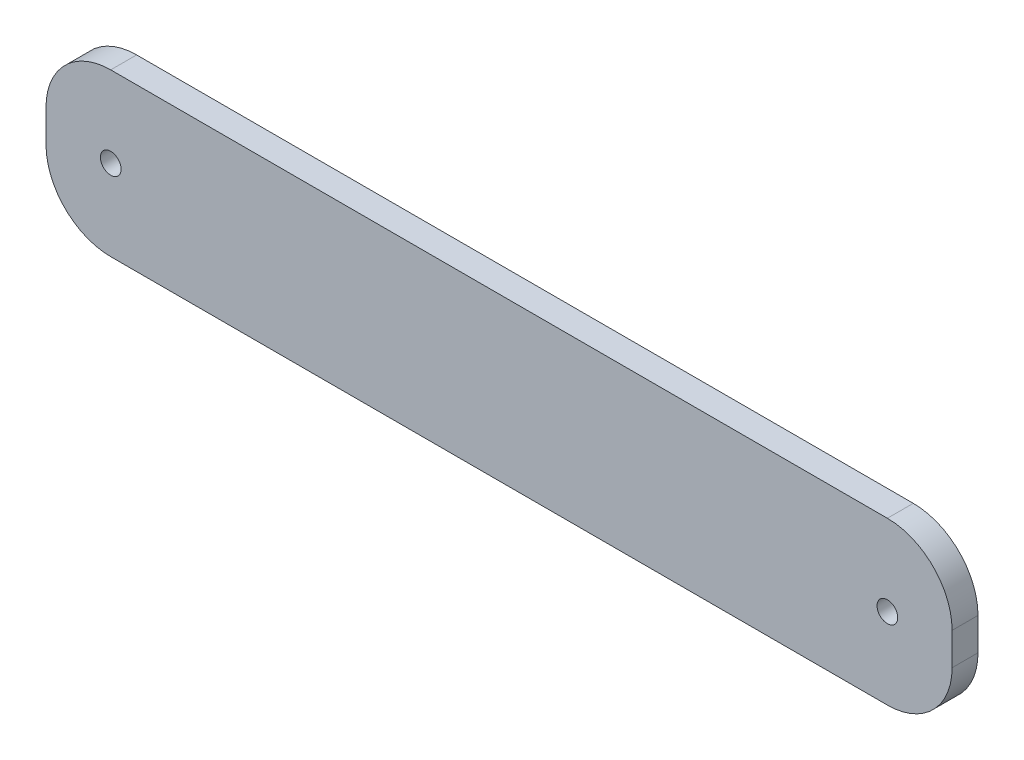
ISO-10303-21;
HEADER;
FILE_DESCRIPTION(('STEP AP214'),'2;1');
FILE_NAME('part.step','',(''),(''),'','','');
FILE_SCHEMA(('AUTOMOTIVE_DESIGN { 1 0 10303 214 1 1 1 1 }'));
ENDSEC;
DATA;
#1=APPLICATION_CONTEXT('core data for automotive mechanical design processes');
#2=APPLICATION_PROTOCOL_DEFINITION('international standard','automotive_design',2000,#1);
#3=PRODUCT_CONTEXT('',#1,'mechanical');
#4=PRODUCT('Part','Part','',(#3));
#5=PRODUCT_RELATED_PRODUCT_CATEGORY('part','',(#4));
#6=PRODUCT_DEFINITION_FORMATION('','',#4);
#7=PRODUCT_DEFINITION_CONTEXT('part definition',#1,'design');
#8=PRODUCT_DEFINITION('design','',#6,#7);
#9=PRODUCT_DEFINITION_SHAPE('','',#8);
#10=(LENGTH_UNIT() NAMED_UNIT(*) SI_UNIT(.MILLI.,.METRE.));
#11=(NAMED_UNIT(*) PLANE_ANGLE_UNIT() SI_UNIT($,.RADIAN.));
#12=(NAMED_UNIT(*) SI_UNIT($,.STERADIAN.) SOLID_ANGLE_UNIT());
#13=UNCERTAINTY_MEASURE_WITH_UNIT(LENGTH_MEASURE(1.E-05),#10,'distance_accuracy_value','');
#14=(GEOMETRIC_REPRESENTATION_CONTEXT(3) GLOBAL_UNCERTAINTY_ASSIGNED_CONTEXT((#13)) GLOBAL_UNIT_ASSIGNED_CONTEXT((#10,
#11,#12)) REPRESENTATION_CONTEXT('',''));
#15=CARTESIAN_POINT('',(0.,0.,0.));
#16=DIRECTION('',(0.,0.,1.));
#17=DIRECTION('',(1.,0.,0.));
#18=AXIS2_PLACEMENT_3D('',#15,#16,#17);
#19=CARTESIAN_POINT('',(0.,0.,4.));
#20=DIRECTION('',(0.,0.,-1.));
#21=DIRECTION('',(-1.,0.,0.));
#22=AXIS2_PLACEMENT_3D('',#19,#20,#21);
#23=PLANE('',#22);
#24=CARTESIAN_POINT('',(-60.,0.,4.));
#25=DIRECTION('',(0.,0.,1.));
#26=DIRECTION('',(1.,0.,0.));
#27=AXIS2_PLACEMENT_3D('',#24,#25,#26);
#28=CIRCLE('',#27,1.6);
#29=CARTESIAN_POINT('',(-58.4,0.,4.));
#30=VERTEX_POINT('',#29);
#31=EDGE_CURVE('E175',#30,#30,#28,.T.);
#32=ORIENTED_EDGE('',*,*,#31,.F.);
#33=EDGE_LOOP('',(#32));
#34=FACE_BOUND('',#33,.T.);
#35=DIRECTION('',(-1.,0.,0.));
#36=VECTOR('',#35,1.);
#37=CARTESIAN_POINT('',(-70.,12.5,4.));
#38=LINE('',#37,#36);
#39=CARTESIAN_POINT('',(60.,12.5,4.));
#40=VERTEX_POINT('',#39);
#41=CARTESIAN_POINT('',(-60.,12.5,4.));
#42=VERTEX_POINT('',#41);
#43=EDGE_CURVE('E170',#40,#42,#38,.T.);
#44=ORIENTED_EDGE('',*,*,#43,.T.);
#45=CARTESIAN_POINT('',(-60.,2.5,4.));
#46=DIRECTION('',(0.,0.,-1.));
#47=DIRECTION('',(-1.,0.,0.));
#48=AXIS2_PLACEMENT_3D('',#45,#46,#47);
#49=CIRCLE('',#48,10.);
#50=CARTESIAN_POINT('',(-70.,2.5,4.));
#51=VERTEX_POINT('',#50);
#52=EDGE_CURVE('E151',#42,#51,#49,.F.);
#53=ORIENTED_EDGE('',*,*,#52,.T.);
#54=DIRECTION('',(0.,-1.,0.));
#55=VECTOR('',#54,1.);
#56=CARTESIAN_POINT('',(-70.,-12.5,4.));
#57=LINE('',#56,#55);
#58=CARTESIAN_POINT('',(-70.,-2.5,4.));
#59=VERTEX_POINT('',#58);
#60=EDGE_CURVE('E121',#51,#59,#57,.T.);
#61=ORIENTED_EDGE('',*,*,#60,.T.);
#62=CARTESIAN_POINT('',(-60.,-2.5,4.));
#63=DIRECTION('',(0.,0.,-1.));
#64=DIRECTION('',(-1.,0.,0.));
#65=AXIS2_PLACEMENT_3D('',#62,#63,#64);
#66=CIRCLE('',#65,10.);
#67=CARTESIAN_POINT('',(-60.,-12.5,4.));
#68=VERTEX_POINT('',#67);
#69=EDGE_CURVE('E57',#59,#68,#66,.F.);
#70=ORIENTED_EDGE('',*,*,#69,.T.);
#71=DIRECTION('',(1.,0.,0.));
#72=VECTOR('',#71,1.);
#73=CARTESIAN_POINT('',(-70.,-12.5,4.));
#74=LINE('',#73,#72);
#75=CARTESIAN_POINT('',(60.,-12.5,4.));
#76=VERTEX_POINT('',#75);
#77=EDGE_CURVE('E137',#68,#76,#74,.T.);
#78=ORIENTED_EDGE('',*,*,#77,.T.);
#79=CARTESIAN_POINT('',(60.,-2.5,4.));
#80=DIRECTION('',(0.,0.,-1.));
#81=DIRECTION('',(-1.,0.,0.));
#82=AXIS2_PLACEMENT_3D('',#79,#80,#81);
#83=CIRCLE('',#82,10.);
#84=CARTESIAN_POINT('',(70.,-2.5,4.));
#85=VERTEX_POINT('',#84);
#86=EDGE_CURVE('E148',#76,#85,#83,.F.);
#87=ORIENTED_EDGE('',*,*,#86,.T.);
#88=DIRECTION('',(0.,1.,0.));
#89=VECTOR('',#88,1.);
#90=CARTESIAN_POINT('',(70.,-12.5,4.));
#91=LINE('',#90,#89);
#92=CARTESIAN_POINT('',(70.,2.5,4.));
#93=VERTEX_POINT('',#92);
#94=EDGE_CURVE('E131',#85,#93,#91,.T.);
#95=ORIENTED_EDGE('',*,*,#94,.T.);
#96=CARTESIAN_POINT('',(60.,2.5,4.));
#97=DIRECTION('',(0.,0.,-1.));
#98=DIRECTION('',(-1.,0.,0.));
#99=AXIS2_PLACEMENT_3D('',#96,#97,#98);
#100=CIRCLE('',#99,10.);
#101=EDGE_CURVE('E146',#93,#40,#100,.F.);
#102=ORIENTED_EDGE('',*,*,#101,.T.);
#103=EDGE_LOOP('',(#44,#53,#61,#70,#78,#87,#95,#102));
#104=FACE_BOUND('',#103,.T.);
#105=CARTESIAN_POINT('',(60.,0.,4.));
#106=DIRECTION('',(0.,0.,1.));
#107=DIRECTION('',(1.,0.,0.));
#108=AXIS2_PLACEMENT_3D('',#105,#106,#107);
#109=CIRCLE('',#108,1.6);
#110=CARTESIAN_POINT('',(61.6,0.,4.));
#111=VERTEX_POINT('',#110);
#112=EDGE_CURVE('E184',#111,#111,#109,.T.);
#113=ORIENTED_EDGE('',*,*,#112,.F.);
#114=EDGE_LOOP('',(#113));
#115=FACE_BOUND('',#114,.T.);
#116=ADVANCED_FACE('F35',(#34,#104,#115),#23,.F.);
#117=CARTESIAN_POINT('',(0.,0.,0.));
#118=DIRECTION('',(0.,0.,-1.));
#119=DIRECTION('',(-1.,0.,0.));
#120=AXIS2_PLACEMENT_3D('',#117,#118,#119);
#121=PLANE('',#120);
#122=CARTESIAN_POINT('',(-60.,0.,0.));
#123=DIRECTION('',(0.,0.,1.));
#124=DIRECTION('',(1.,0.,0.));
#125=AXIS2_PLACEMENT_3D('',#122,#123,#124);
#126=CIRCLE('',#125,1.6);
#127=CARTESIAN_POINT('',(-58.4,0.,0.));
#128=VERTEX_POINT('',#127);
#129=EDGE_CURVE('E177',#128,#128,#126,.T.);
#130=ORIENTED_EDGE('',*,*,#129,.T.);
#131=EDGE_LOOP('',(#130));
#132=FACE_BOUND('',#131,.T.);
#133=DIRECTION('',(0.,-1.,0.));
#134=VECTOR('',#133,1.);
#135=CARTESIAN_POINT('',(-70.,-12.5,0.));
#136=LINE('',#135,#134);
#137=CARTESIAN_POINT('',(-70.,2.5,0.));
#138=VERTEX_POINT('',#137);
#139=CARTESIAN_POINT('',(-70.,-2.5,0.));
#140=VERTEX_POINT('',#139);
#141=EDGE_CURVE('E119',#138,#140,#136,.T.);
#142=ORIENTED_EDGE('',*,*,#141,.F.);
#143=CARTESIAN_POINT('',(-60.,2.5,0.));
#144=DIRECTION('',(0.,0.,-1.));
#145=DIRECTION('',(-1.,0.,0.));
#146=AXIS2_PLACEMENT_3D('',#143,#144,#145);
#147=CIRCLE('',#146,10.);
#148=CARTESIAN_POINT('',(-60.,12.5,0.));
#149=VERTEX_POINT('',#148);
#150=EDGE_CURVE('E102',#138,#149,#147,.T.);
#151=ORIENTED_EDGE('',*,*,#150,.T.);
#152=DIRECTION('',(-1.,0.,0.));
#153=VECTOR('',#152,1.);
#154=CARTESIAN_POINT('',(-70.,12.5,0.));
#155=LINE('',#154,#153);
#156=CARTESIAN_POINT('',(60.,12.5,0.));
#157=VERTEX_POINT('',#156);
#158=EDGE_CURVE('E129',#157,#149,#155,.T.);
#159=ORIENTED_EDGE('',*,*,#158,.F.);
#160=CARTESIAN_POINT('',(60.,2.5,0.));
#161=DIRECTION('',(0.,0.,-1.));
#162=DIRECTION('',(-1.,0.,0.));
#163=AXIS2_PLACEMENT_3D('',#160,#161,#162);
#164=CIRCLE('',#163,10.);
#165=CARTESIAN_POINT('',(70.,2.5,0.));
#166=VERTEX_POINT('',#165);
#167=EDGE_CURVE('E122',#157,#166,#164,.T.);
#168=ORIENTED_EDGE('',*,*,#167,.T.);
#169=DIRECTION('',(0.,1.,0.));
#170=VECTOR('',#169,1.);
#171=CARTESIAN_POINT('',(70.,-12.5,0.));
#172=LINE('',#171,#170);
#173=CARTESIAN_POINT('',(70.,-2.5,0.));
#174=VERTEX_POINT('',#173);
#175=EDGE_CURVE('E133',#174,#166,#172,.T.);
#176=ORIENTED_EDGE('',*,*,#175,.F.);
#177=CARTESIAN_POINT('',(60.,-2.5,0.));
#178=DIRECTION('',(0.,0.,-1.));
#179=DIRECTION('',(-1.,0.,0.));
#180=AXIS2_PLACEMENT_3D('',#177,#178,#179);
#181=CIRCLE('',#180,10.);
#182=CARTESIAN_POINT('',(60.,-12.5,0.));
#183=VERTEX_POINT('',#182);
#184=EDGE_CURVE('E140',#174,#183,#181,.T.);
#185=ORIENTED_EDGE('',*,*,#184,.T.);
#186=DIRECTION('',(1.,0.,0.));
#187=VECTOR('',#186,1.);
#188=CARTESIAN_POINT('',(-70.,-12.5,0.));
#189=LINE('',#188,#187);
#190=CARTESIAN_POINT('',(-60.,-12.5,0.));
#191=VERTEX_POINT('',#190);
#192=EDGE_CURVE('E128',#191,#183,#189,.T.);
#193=ORIENTED_EDGE('',*,*,#192,.F.);
#194=CARTESIAN_POINT('',(-60.,-2.5,0.));
#195=DIRECTION('',(0.,0.,-1.));
#196=DIRECTION('',(-1.,0.,0.));
#197=AXIS2_PLACEMENT_3D('',#194,#195,#196);
#198=CIRCLE('',#197,10.);
#199=EDGE_CURVE('E113',#191,#140,#198,.T.);
#200=ORIENTED_EDGE('',*,*,#199,.T.);
#201=EDGE_LOOP('',(#142,#151,#159,#168,#176,#185,#193,#200));
#202=FACE_BOUND('',#201,.T.);
#203=CARTESIAN_POINT('',(60.,0.,0.));
#204=DIRECTION('',(0.,0.,1.));
#205=DIRECTION('',(1.,0.,0.));
#206=AXIS2_PLACEMENT_3D('',#203,#204,#205);
#207=CIRCLE('',#206,1.6);
#208=CARTESIAN_POINT('',(61.6,0.,0.));
#209=VERTEX_POINT('',#208);
#210=EDGE_CURVE('E186',#209,#209,#207,.T.);
#211=ORIENTED_EDGE('',*,*,#210,.T.);
#212=EDGE_LOOP('',(#211));
#213=FACE_BOUND('',#212,.T.);
#214=ADVANCED_FACE('F125',(#132,#202,#213),#121,.T.);
#215=CARTESIAN_POINT('',(70.,-12.5,4.));
#216=DIRECTION('',(-1.,0.,0.));
#217=DIRECTION('',(0.,0.,1.));
#218=AXIS2_PLACEMENT_3D('',#215,#216,#217);
#219=PLANE('',#218);
#220=ORIENTED_EDGE('',*,*,#94,.F.);
#221=DIRECTION('',(0.,0.,-1.));
#222=VECTOR('',#221,1.);
#223=CARTESIAN_POINT('',(70.,-2.5,4.));
#224=LINE('',#223,#222);
#225=EDGE_CURVE('E11',#85,#174,#224,.T.);
#226=ORIENTED_EDGE('',*,*,#225,.T.);
#227=ORIENTED_EDGE('',*,*,#175,.T.);
#228=DIRECTION('',(0.,0.,-1.));
#229=VECTOR('',#228,1.);
#230=CARTESIAN_POINT('',(70.,2.5,4.));
#231=LINE('',#230,#229);
#232=EDGE_CURVE('E43',#166,#93,#231,.F.);
#233=ORIENTED_EDGE('',*,*,#232,.T.);
#234=EDGE_LOOP('',(#220,#226,#227,#233));
#235=FACE_BOUND('',#234,.T.);
#236=ADVANCED_FACE('F161',(#235),#219,.F.);
#237=CARTESIAN_POINT('',(-70.,12.5,4.));
#238=DIRECTION('',(0.,-1.,0.));
#239=DIRECTION('',(1.,0.,0.));
#240=AXIS2_PLACEMENT_3D('',#237,#238,#239);
#241=PLANE('',#240);
#242=ORIENTED_EDGE('',*,*,#158,.T.);
#243=DIRECTION('',(0.,0.,-1.));
#244=VECTOR('',#243,1.);
#245=CARTESIAN_POINT('',(-60.,12.5,4.));
#246=LINE('',#245,#244);
#247=EDGE_CURVE('E107',#149,#42,#246,.F.);
#248=ORIENTED_EDGE('',*,*,#247,.T.);
#249=ORIENTED_EDGE('',*,*,#43,.F.);
#250=DIRECTION('',(0.,0.,-1.));
#251=VECTOR('',#250,1.);
#252=CARTESIAN_POINT('',(60.,12.5,4.));
#253=LINE('',#252,#251);
#254=EDGE_CURVE('E112',#40,#157,#253,.T.);
#255=ORIENTED_EDGE('',*,*,#254,.T.);
#256=EDGE_LOOP('',(#242,#248,#249,#255));
#257=FACE_BOUND('',#256,.T.);
#258=ADVANCED_FACE('F174',(#257),#241,.F.);
#259=CARTESIAN_POINT('',(-70.,-12.5,4.));
#260=DIRECTION('',(1.,0.,0.));
#261=DIRECTION('',(0.,0.,-1.));
#262=AXIS2_PLACEMENT_3D('',#259,#260,#261);
#263=PLANE('',#262);
#264=ORIENTED_EDGE('',*,*,#60,.F.);
#265=DIRECTION('',(0.,0.,-1.));
#266=VECTOR('',#265,1.);
#267=CARTESIAN_POINT('',(-70.,2.5,4.));
#268=LINE('',#267,#266);
#269=EDGE_CURVE('E106',#51,#138,#268,.T.);
#270=ORIENTED_EDGE('',*,*,#269,.T.);
#271=ORIENTED_EDGE('',*,*,#141,.T.);
#272=DIRECTION('',(0.,0.,-1.));
#273=VECTOR('',#272,1.);
#274=CARTESIAN_POINT('',(-70.,-2.5,4.));
#275=LINE('',#274,#273);
#276=EDGE_CURVE('E123',#140,#59,#275,.F.);
#277=ORIENTED_EDGE('',*,*,#276,.T.);
#278=EDGE_LOOP('',(#264,#270,#271,#277));
#279=FACE_BOUND('',#278,.T.);
#280=ADVANCED_FACE('F118',(#279),#263,.F.);
#281=CARTESIAN_POINT('',(-70.,-12.5,4.));
#282=DIRECTION('',(0.,1.,0.));
#283=DIRECTION('',(0.,0.,1.));
#284=AXIS2_PLACEMENT_3D('',#281,#282,#283);
#285=PLANE('',#284);
#286=ORIENTED_EDGE('',*,*,#77,.F.);
#287=DIRECTION('',(0.,0.,-1.));
#288=VECTOR('',#287,1.);
#289=CARTESIAN_POINT('',(-60.,-12.5,4.));
#290=LINE('',#289,#288);
#291=EDGE_CURVE('E154',#68,#191,#290,.T.);
#292=ORIENTED_EDGE('',*,*,#291,.T.);
#293=ORIENTED_EDGE('',*,*,#192,.T.);
#294=DIRECTION('',(0.,0.,-1.));
#295=VECTOR('',#294,1.);
#296=CARTESIAN_POINT('',(60.,-12.5,4.));
#297=LINE('',#296,#295);
#298=EDGE_CURVE('E50',#183,#76,#297,.F.);
#299=ORIENTED_EDGE('',*,*,#298,.T.);
#300=EDGE_LOOP('',(#286,#292,#293,#299));
#301=FACE_BOUND('',#300,.T.);
#302=ADVANCED_FACE('F207',(#301),#285,.F.);
#303=CARTESIAN_POINT('',(-60.,0.,4.));
#304=DIRECTION('',(0.,0.,-1.));
#305=DIRECTION('',(-1.,0.,0.));
#306=AXIS2_PLACEMENT_3D('',#303,#304,#305);
#307=CYLINDRICAL_SURFACE('',#306,1.6);
#308=ORIENTED_EDGE('',*,*,#31,.T.);
#309=EDGE_LOOP('',(#308));
#310=FACE_BOUND('',#309,.T.);
#311=ORIENTED_EDGE('',*,*,#129,.F.);
#312=EDGE_LOOP('',(#311));
#313=FACE_BOUND('',#312,.T.);
#314=ADVANCED_FACE('F204',(#310,#313),#307,.F.);
#315=CARTESIAN_POINT('',(60.,0.,4.));
#316=DIRECTION('',(0.,0.,-1.));
#317=DIRECTION('',(-1.,0.,0.));
#318=AXIS2_PLACEMENT_3D('',#315,#316,#317);
#319=CYLINDRICAL_SURFACE('',#318,1.6);
#320=ORIENTED_EDGE('',*,*,#112,.T.);
#321=EDGE_LOOP('',(#320));
#322=FACE_BOUND('',#321,.T.);
#323=ORIENTED_EDGE('',*,*,#210,.F.);
#324=EDGE_LOOP('',(#323));
#325=FACE_BOUND('',#324,.T.);
#326=ADVANCED_FACE('F192',(#322,#325),#319,.F.);
#327=CARTESIAN_POINT('',(-60.,2.5,4.));
#328=DIRECTION('',(0.,0.,-1.));
#329=DIRECTION('',(-1.,0.,0.));
#330=AXIS2_PLACEMENT_3D('',#327,#328,#329);
#331=CYLINDRICAL_SURFACE('',#330,10.);
#332=ORIENTED_EDGE('',*,*,#52,.F.);
#333=ORIENTED_EDGE('',*,*,#247,.F.);
#334=ORIENTED_EDGE('',*,*,#150,.F.);
#335=ORIENTED_EDGE('',*,*,#269,.F.);
#336=EDGE_LOOP('',(#332,#333,#334,#335));
#337=FACE_BOUND('',#336,.T.);
#338=ADVANCED_FACE('F105',(#337),#331,.T.);
#339=CARTESIAN_POINT('',(-60.,-2.5,4.));
#340=DIRECTION('',(0.,0.,-1.));
#341=DIRECTION('',(-1.,0.,0.));
#342=AXIS2_PLACEMENT_3D('',#339,#340,#341);
#343=CYLINDRICAL_SURFACE('',#342,10.);
#344=ORIENTED_EDGE('',*,*,#69,.F.);
#345=ORIENTED_EDGE('',*,*,#276,.F.);
#346=ORIENTED_EDGE('',*,*,#199,.F.);
#347=ORIENTED_EDGE('',*,*,#291,.F.);
#348=EDGE_LOOP('',(#344,#345,#346,#347));
#349=FACE_BOUND('',#348,.T.);
#350=ADVANCED_FACE('F218',(#349),#343,.T.);
#351=CARTESIAN_POINT('',(60.,-2.5,4.));
#352=DIRECTION('',(0.,0.,-1.));
#353=DIRECTION('',(-1.,0.,0.));
#354=AXIS2_PLACEMENT_3D('',#351,#352,#353);
#355=CYLINDRICAL_SURFACE('',#354,10.);
#356=ORIENTED_EDGE('',*,*,#86,.F.);
#357=ORIENTED_EDGE('',*,*,#298,.F.);
#358=ORIENTED_EDGE('',*,*,#184,.F.);
#359=ORIENTED_EDGE('',*,*,#225,.F.);
#360=EDGE_LOOP('',(#356,#357,#358,#359));
#361=FACE_BOUND('',#360,.T.);
#362=ADVANCED_FACE('F220',(#361),#355,.T.);
#363=CARTESIAN_POINT('',(60.,2.5,4.));
#364=DIRECTION('',(0.,0.,-1.));
#365=DIRECTION('',(-1.,0.,0.));
#366=AXIS2_PLACEMENT_3D('',#363,#364,#365);
#367=CYLINDRICAL_SURFACE('',#366,10.);
#368=ORIENTED_EDGE('',*,*,#101,.F.);
#369=ORIENTED_EDGE('',*,*,#232,.F.);
#370=ORIENTED_EDGE('',*,*,#167,.F.);
#371=ORIENTED_EDGE('',*,*,#254,.F.);
#372=EDGE_LOOP('',(#368,#369,#370,#371));
#373=FACE_BOUND('',#372,.T.);
#374=ADVANCED_FACE('F37',(#373),#367,.T.);
#375=CLOSED_SHELL('',(#116,#214,#236,#258,#280,#302,#314,#326,#338,#350,#362,#374));
#376=MANIFOLD_SOLID_BREP('B2',#375);
#377=ADVANCED_BREP_SHAPE_REPRESENTATION('',(#18,#376),#14);
#378=SHAPE_DEFINITION_REPRESENTATION(#9,#377);
ENDSEC;
END-ISO-10303-21;
